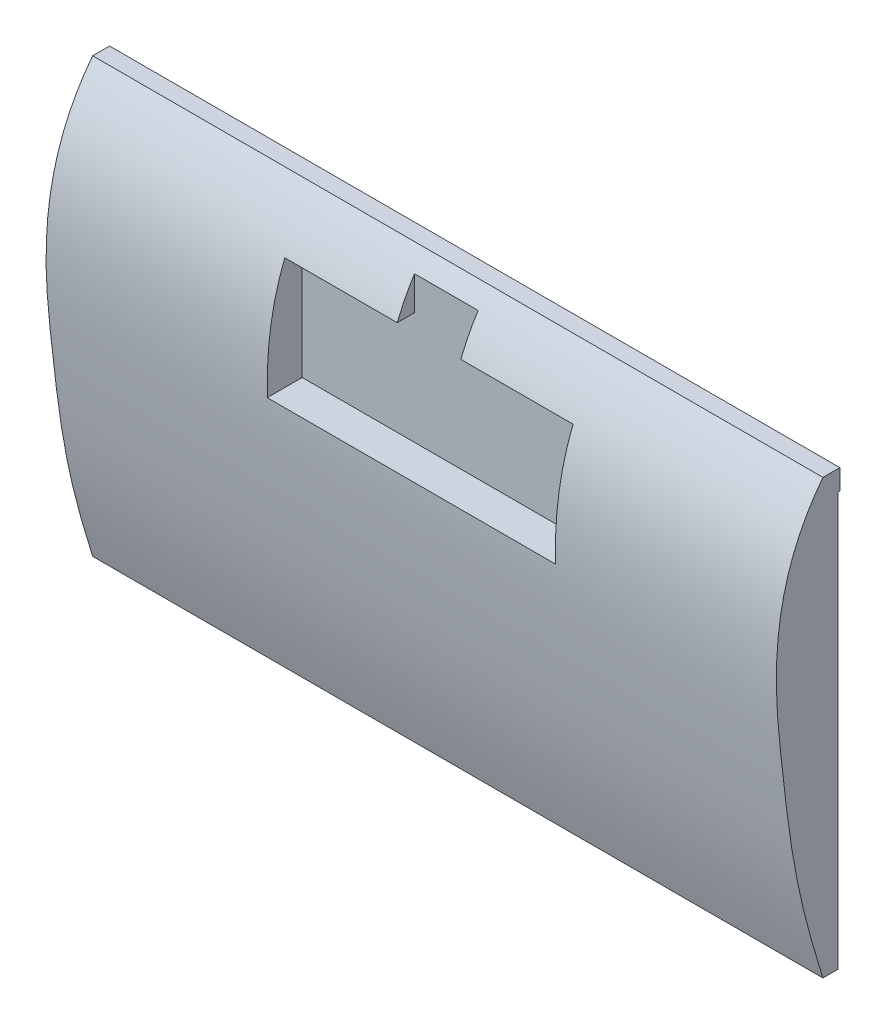
ISO-10303-21;
HEADER;
FILE_DESCRIPTION(('STEP AP214'),'2;1');
FILE_NAME('part.step','',(''),(''),'','','');
FILE_SCHEMA(('AUTOMOTIVE_DESIGN { 1 0 10303 214 1 1 1 1 }'));
ENDSEC;
DATA;
#1=APPLICATION_CONTEXT('core data for automotive mechanical design processes');
#2=APPLICATION_PROTOCOL_DEFINITION('international standard','automotive_design',2000,#1);
#3=PRODUCT_CONTEXT('',#1,'mechanical');
#4=PRODUCT('Part','Part','',(#3));
#5=PRODUCT_RELATED_PRODUCT_CATEGORY('part','',(#4));
#6=PRODUCT_DEFINITION_FORMATION('','',#4);
#7=PRODUCT_DEFINITION_CONTEXT('part definition',#1,'design');
#8=PRODUCT_DEFINITION('design','',#6,#7);
#9=PRODUCT_DEFINITION_SHAPE('','',#8);
#10=(LENGTH_UNIT() NAMED_UNIT(*) SI_UNIT(.MILLI.,.METRE.));
#11=(NAMED_UNIT(*) PLANE_ANGLE_UNIT() SI_UNIT($,.RADIAN.));
#12=(NAMED_UNIT(*) SI_UNIT($,.STERADIAN.) SOLID_ANGLE_UNIT());
#13=UNCERTAINTY_MEASURE_WITH_UNIT(LENGTH_MEASURE(1.E-05),#10,'distance_accuracy_value','');
#14=(GEOMETRIC_REPRESENTATION_CONTEXT(3) GLOBAL_UNCERTAINTY_ASSIGNED_CONTEXT((#13)) GLOBAL_UNIT_ASSIGNED_CONTEXT((#10,
#11,#12)) REPRESENTATION_CONTEXT('',''));
#15=CARTESIAN_POINT('',(0.,0.,0.));
#16=DIRECTION('',(0.,0.,1.));
#17=DIRECTION('',(1.,0.,0.));
#18=AXIS2_PLACEMENT_3D('',#15,#16,#17);
#19=CARTESIAN_POINT('',(0.,0.,0.));
#20=DIRECTION('',(0.,0.,1.));
#21=DIRECTION('',(1.,0.,0.));
#22=AXIS2_PLACEMENT_3D('',#19,#20,#21);
#23=PLANE('',#22);
#24=DIRECTION('',(-1.,0.,0.));
#25=VECTOR('',#24,1.);
#26=CARTESIAN_POINT('',(-269.85,145.2,0.));
#27=LINE('',#26,#25);
#28=CARTESIAN_POINT('',(269.85,145.2,0.));
#29=VERTEX_POINT('',#28);
#30=CARTESIAN_POINT('',(-269.85,145.2,0.));
#31=VERTEX_POINT('',#30);
#32=EDGE_CURVE('E72',#29,#31,#27,.T.);
#33=ORIENTED_EDGE('',*,*,#32,.F.);
#34=DIRECTION('',(0.,1.,0.));
#35=VECTOR('',#34,1.);
#36=CARTESIAN_POINT('',(269.85,160.2,0.));
#37=LINE('',#36,#35);
#38=CARTESIAN_POINT('',(269.85,-160.2,0.));
#39=VERTEX_POINT('',#38);
#40=EDGE_CURVE('E223',#39,#29,#37,.T.);
#41=ORIENTED_EDGE('',*,*,#40,.F.);
#42=DIRECTION('',(1.,0.,0.));
#43=VECTOR('',#42,1.);
#44=CARTESIAN_POINT('',(-269.85,-160.2,0.));
#45=LINE('',#44,#43);
#46=CARTESIAN_POINT('',(-269.85,-160.2,0.));
#47=VERTEX_POINT('',#46);
#48=EDGE_CURVE('E271',#47,#39,#45,.T.);
#49=ORIENTED_EDGE('',*,*,#48,.F.);
#50=DIRECTION('',(0.,-1.,0.));
#51=VECTOR('',#50,1.);
#52=CARTESIAN_POINT('',(-269.85,160.2,0.));
#53=LINE('',#52,#51);
#54=EDGE_CURVE('E265',#31,#47,#53,.T.);
#55=ORIENTED_EDGE('',*,*,#54,.F.);
#56=EDGE_LOOP('',(#33,#41,#49,#55));
#57=FACE_BOUND('',#56,.T.);
#58=ADVANCED_FACE('F57',(#57),#23,.F.);
#59=CARTESIAN_POINT('',(593.045767792688,-160.2,10.9999999999999));
#60=CARTESIAN_POINT('',(593.045767792688,-99.1604529431981,30.1409312448953));
#61=CARTESIAN_POINT('',(593.045767792688,-46.1984389401702,38.0741934930687));
#62=CARTESIAN_POINT('',(593.045767792688,105.581967835009,53.4186788939106));
#63=CARTESIAN_POINT('',(593.045767792688,160.2,11.));
#64=B_SPLINE_CURVE_WITH_KNOTS('',3,(#59,#60,#61,#62,#63),.UNSPECIFIED.,.F.,.F.,(4,1,4),(0.,
0.569165375382371,1.),.UNSPECIFIED.);
#65=DIRECTION('',(-1.,0.,0.));
#66=VECTOR('',#65,1.);
#67=SURFACE_OF_LINEAR_EXTRUSION('',#64,#66);
#68=CARTESIAN_POINT('',(269.85,-160.2,10.9999999999999));
#69=CARTESIAN_POINT('',(269.85,-99.1604529431982,30.1409312448953));
#70=CARTESIAN_POINT('',(269.85,-46.1984389401703,38.0741934930687));
#71=CARTESIAN_POINT('',(269.85,105.581967835009,53.4186788939106));
#72=CARTESIAN_POINT('',(269.85,160.2,11.));
#73=B_SPLINE_CURVE_WITH_KNOTS('',3,(#68,#69,#70,#71,#72),.UNSPECIFIED.,.F.,.F.,(4,1,4),(0.,
0.569165375382371,1.),.UNSPECIFIED.);
#74=CARTESIAN_POINT('',(269.85,160.2,11.));
#75=VERTEX_POINT('',#74);
#76=CARTESIAN_POINT('',(269.85,-160.2,11.));
#77=VERTEX_POINT('',#76);
#78=EDGE_CURVE('E218',#75,#77,#73,.F.);
#79=ORIENTED_EDGE('',*,*,#78,.F.);
#80=DIRECTION('',(-1.,0.,0.));
#81=VECTOR('',#80,1.);
#82=CARTESIAN_POINT('',(-269.85,160.2,11.));
#83=LINE('',#82,#81);
#84=CARTESIAN_POINT('',(-269.85,160.2,11.));
#85=VERTEX_POINT('',#84);
#86=EDGE_CURVE('E276',#75,#85,#83,.T.);
#87=ORIENTED_EDGE('',*,*,#86,.T.);
#88=CARTESIAN_POINT('',(-269.85,-160.2,10.9999999999999));
#89=CARTESIAN_POINT('',(-269.85,-99.1604529431984,30.1409312448953));
#90=CARTESIAN_POINT('',(-269.85,-46.1984389401705,38.0741934930687));
#91=CARTESIAN_POINT('',(-269.85,105.581967835008,53.4186788939106));
#92=CARTESIAN_POINT('',(-269.85,160.2,11.));
#93=B_SPLINE_CURVE_WITH_KNOTS('',3,(#88,#89,#90,#91,#92),.UNSPECIFIED.,.F.,.F.,(4,1,4),(0.,
0.569165375382371,1.),.UNSPECIFIED.);
#94=CARTESIAN_POINT('',(-269.85,-160.2,11.));
#95=VERTEX_POINT('',#94);
#96=EDGE_CURVE('E160',#95,#85,#93,.T.);
#97=ORIENTED_EDGE('',*,*,#96,.F.);
#98=DIRECTION('',(1.,0.,0.));
#99=VECTOR('',#98,1.);
#100=CARTESIAN_POINT('',(-269.85,-160.2,11.));
#101=LINE('',#100,#99);
#102=EDGE_CURVE('E274',#95,#77,#101,.T.);
#103=ORIENTED_EDGE('',*,*,#102,.T.);
#104=EDGE_LOOP('',(#79,#87,#97,#103));
#105=FACE_BOUND('',#104,.T.);
#106=CARTESIAN_POINT('',(-106.5,-160.2,10.9999999999999));
#107=CARTESIAN_POINT('',(-106.5,-99.1604529431983,30.1409312448953));
#108=CARTESIAN_POINT('',(-106.5,-46.1984389401705,38.0741934930687));
#109=CARTESIAN_POINT('',(-106.5,105.581967835008,53.4186788939106));
#110=CARTESIAN_POINT('',(-106.5,160.2,11.));
#111=B_SPLINE_CURVE_WITH_KNOTS('',3,(#106,#107,#108,#109,#110),.UNSPECIFIED.,.F.,.F.,(4,1,4),
(0.,0.569165375382371,1.),.UNSPECIFIED.);
#112=CARTESIAN_POINT('',(-106.5,123.2,32.2921193803987));
#113=VERTEX_POINT('',#112);
#114=CARTESIAN_POINT('',(-106.5,40.2000000000002,45.3093353813427));
#115=VERTEX_POINT('',#114);
#116=EDGE_CURVE('E299',#113,#115,#111,.F.);
#117=ORIENTED_EDGE('',*,*,#116,.F.);
#118=DIRECTION('',(-1.,0.,0.));
#119=VECTOR('',#118,1.);
#120=CARTESIAN_POINT('',(1.17146576669515E-13,123.2,32.2921193803987));
#121=LINE('',#120,#119);
#122=CARTESIAN_POINT('',(-23.5,123.2,32.2921193803987));
#123=VERTEX_POINT('',#122);
#124=EDGE_CURVE('E12',#113,#123,#121,.F.);
#125=ORIENTED_EDGE('',*,*,#124,.T.);
#126=CARTESIAN_POINT('',(-23.5,-160.2,10.9999999999999));
#127=CARTESIAN_POINT('',(-23.5,-99.1604529431983,30.1409312448953));
#128=CARTESIAN_POINT('',(-23.5,-46.1984389401704,38.0741934930687));
#129=CARTESIAN_POINT('',(-23.5000000000001,105.581967835008,53.4186788939106));
#130=CARTESIAN_POINT('',(-23.5000000000001,160.2,11.));
#131=B_SPLINE_CURVE_WITH_KNOTS('',3,(#126,#127,#128,#129,#130),.UNSPECIFIED.,.F.,.F.,(4,1,4),
(0.,0.569165375382371,1.),.UNSPECIFIED.);
#132=CARTESIAN_POINT('',(-23.5,148.117876211777,19.5));
#133=VERTEX_POINT('',#132);
#134=EDGE_CURVE('E65',#133,#123,#131,.F.);
#135=ORIENTED_EDGE('',*,*,#134,.F.);
#136=DIRECTION('',(-1.,0.,0.));
#137=VECTOR('',#136,1.);
#138=CARTESIAN_POINT('',(1.11755637585344E-13,148.117876211777,19.5));
#139=LINE('',#138,#137);
#140=CARTESIAN_POINT('',(23.5,148.117876211777,19.5));
#141=VERTEX_POINT('',#140);
#142=EDGE_CURVE('E306',#141,#133,#139,.T.);
#143=ORIENTED_EDGE('',*,*,#142,.F.);
#144=CARTESIAN_POINT('',(23.5,-160.2,10.9999999999999));
#145=CARTESIAN_POINT('',(23.5,-99.1604529431983,30.1409312448953));
#146=CARTESIAN_POINT('',(23.5,-46.1984389401704,38.0741934930687));
#147=CARTESIAN_POINT('',(23.4999999999999,105.581967835008,53.4186788939106));
#148=CARTESIAN_POINT('',(23.4999999999999,160.2,11.));
#149=B_SPLINE_CURVE_WITH_KNOTS('',3,(#144,#145,#146,#147,#148),.UNSPECIFIED.,.F.,.F.,(4,1,4),
(0.,0.569165375382371,1.),.UNSPECIFIED.);
#150=CARTESIAN_POINT('',(23.5,123.2,32.2921193803987));
#151=VERTEX_POINT('',#150);
#152=EDGE_CURVE('E294',#141,#151,#149,.F.);
#153=ORIENTED_EDGE('',*,*,#152,.T.);
#154=DIRECTION('',(-1.,0.,0.));
#155=VECTOR('',#154,1.);
#156=CARTESIAN_POINT('',(1.17146576669515E-13,123.2,32.2921193803987));
#157=LINE('',#156,#155);
#158=CARTESIAN_POINT('',(106.5,123.2,32.2921193803987));
#159=VERTEX_POINT('',#158);
#160=EDGE_CURVE('E281',#151,#159,#157,.F.);
#161=ORIENTED_EDGE('',*,*,#160,.T.);
#162=CARTESIAN_POINT('',(106.5,-160.2,10.9999999999999));
#163=CARTESIAN_POINT('',(106.5,-99.1604529431983,30.1409312448953));
#164=CARTESIAN_POINT('',(106.5,-46.1984389401704,38.0741934930687));
#165=CARTESIAN_POINT('',(106.5,105.581967835008,53.4186788939106));
#166=CARTESIAN_POINT('',(106.5,160.2,11.));
#167=B_SPLINE_CURVE_WITH_KNOTS('',3,(#162,#163,#164,#165,#166),.UNSPECIFIED.,.F.,.F.,(4,1,4),
(0.,0.569165375382371,1.),.UNSPECIFIED.);
#168=CARTESIAN_POINT('',(106.5,40.2000000000002,45.3093353813427));
#169=VERTEX_POINT('',#168);
#170=EDGE_CURVE('E284',#159,#169,#167,.F.);
#171=ORIENTED_EDGE('',*,*,#170,.T.);
#172=DIRECTION('',(-1.,0.,0.));
#173=VECTOR('',#172,1.);
#174=CARTESIAN_POINT('',(1.57529937230686E-13,40.2000000000002,45.3093353813427));
#175=LINE('',#174,#173);
#176=EDGE_CURVE('E289',#115,#169,#175,.F.);
#177=ORIENTED_EDGE('',*,*,#176,.F.);
#178=EDGE_LOOP('',(#117,#125,#135,#143,#153,#161,#171,#177));
#179=FACE_BOUND('',#178,.T.);
#180=ADVANCED_FACE('F238',(#105,#179),#67,.T.);
#181=CARTESIAN_POINT('',(269.85,160.2,11.));
#182=DIRECTION('',(-1.,0.,0.));
#183=DIRECTION('',(0.,-1.,0.));
#184=AXIS2_PLACEMENT_3D('',#181,#182,#183);
#185=PLANE('',#184);
#186=ORIENTED_EDGE('',*,*,#40,.T.);
#187=DIRECTION('',(0.,0.,1.));
#188=VECTOR('',#187,1.);
#189=CARTESIAN_POINT('',(269.85,145.2,-1.5));
#190=LINE('',#189,#188);
#191=CARTESIAN_POINT('',(269.85,145.2,-1.5));
#192=VERTEX_POINT('',#191);
#193=EDGE_CURVE('E185',#192,#29,#190,.T.);
#194=ORIENTED_EDGE('',*,*,#193,.F.);
#195=DIRECTION('',(0.,-1.,0.));
#196=VECTOR('',#195,1.);
#197=CARTESIAN_POINT('',(269.85,160.2,-1.5));
#198=LINE('',#197,#196);
#199=CARTESIAN_POINT('',(269.85,160.2,-1.5));
#200=VERTEX_POINT('',#199);
#201=EDGE_CURVE('E172',#200,#192,#198,.T.);
#202=ORIENTED_EDGE('',*,*,#201,.F.);
#203=DIRECTION('',(0.,0.,-1.));
#204=VECTOR('',#203,1.);
#205=CARTESIAN_POINT('',(269.85,160.2,11.));
#206=LINE('',#205,#204);
#207=EDGE_CURVE('E164',#75,#200,#206,.T.);
#208=ORIENTED_EDGE('',*,*,#207,.F.);
#209=ORIENTED_EDGE('',*,*,#78,.T.);
#210=DIRECTION('',(0.,0.,-1.));
#211=VECTOR('',#210,1.);
#212=CARTESIAN_POINT('',(269.85,-160.2,11.));
#213=LINE('',#212,#211);
#214=EDGE_CURVE('E263',#77,#39,#213,.T.);
#215=ORIENTED_EDGE('',*,*,#214,.T.);
#216=EDGE_LOOP('',(#186,#194,#202,#208,#209,#215));
#217=FACE_BOUND('',#216,.T.);
#218=ADVANCED_FACE('F59',(#217),#185,.F.);
#219=CARTESIAN_POINT('',(-269.85,160.2,11.));
#220=DIRECTION('',(0.,-1.,0.));
#221=DIRECTION('',(0.,0.,-1.));
#222=AXIS2_PLACEMENT_3D('',#219,#220,#221);
#223=PLANE('',#222);
#224=ORIENTED_EDGE('',*,*,#207,.T.);
#225=DIRECTION('',(1.,0.,0.));
#226=VECTOR('',#225,1.);
#227=CARTESIAN_POINT('',(-269.85,160.2,-1.5));
#228=LINE('',#227,#226);
#229=CARTESIAN_POINT('',(-269.85,160.2,-1.5));
#230=VERTEX_POINT('',#229);
#231=EDGE_CURVE('E168',#230,#200,#228,.T.);
#232=ORIENTED_EDGE('',*,*,#231,.F.);
#233=DIRECTION('',(0.,0.,-1.));
#234=VECTOR('',#233,1.);
#235=CARTESIAN_POINT('',(-269.85,160.2,11.));
#236=LINE('',#235,#234);
#237=EDGE_CURVE('E153',#85,#230,#236,.T.);
#238=ORIENTED_EDGE('',*,*,#237,.F.);
#239=ORIENTED_EDGE('',*,*,#86,.F.);
#240=EDGE_LOOP('',(#224,#232,#238,#239));
#241=FACE_BOUND('',#240,.T.);
#242=ADVANCED_FACE('F169',(#241),#223,.F.);
#243=CARTESIAN_POINT('',(-269.85,160.2,11.));
#244=DIRECTION('',(1.,0.,0.));
#245=DIRECTION('',(0.,1.,0.));
#246=AXIS2_PLACEMENT_3D('',#243,#244,#245);
#247=PLANE('',#246);
#248=ORIENTED_EDGE('',*,*,#237,.T.);
#249=DIRECTION('',(0.,1.,0.));
#250=VECTOR('',#249,1.);
#251=CARTESIAN_POINT('',(-269.85,160.2,-1.5));
#252=LINE('',#251,#250);
#253=CARTESIAN_POINT('',(-269.85,145.2,-1.5));
#254=VERTEX_POINT('',#253);
#255=EDGE_CURVE('E158',#254,#230,#252,.T.);
#256=ORIENTED_EDGE('',*,*,#255,.F.);
#257=DIRECTION('',(0.,0.,1.));
#258=VECTOR('',#257,1.);
#259=CARTESIAN_POINT('',(-269.85,145.2,-1.5));
#260=LINE('',#259,#258);
#261=EDGE_CURVE('E182',#254,#31,#260,.T.);
#262=ORIENTED_EDGE('',*,*,#261,.T.);
#263=ORIENTED_EDGE('',*,*,#54,.T.);
#264=DIRECTION('',(0.,0.,-1.));
#265=VECTOR('',#264,1.);
#266=CARTESIAN_POINT('',(-269.85,-160.2,11.));
#267=LINE('',#266,#265);
#268=EDGE_CURVE('E165',#95,#47,#267,.T.);
#269=ORIENTED_EDGE('',*,*,#268,.F.);
#270=ORIENTED_EDGE('',*,*,#96,.T.);
#271=EDGE_LOOP('',(#248,#256,#262,#263,#269,#270));
#272=FACE_BOUND('',#271,.T.);
#273=ADVANCED_FACE('F155',(#272),#247,.F.);
#274=CARTESIAN_POINT('',(-269.85,-160.2,11.));
#275=DIRECTION('',(0.,1.,0.));
#276=DIRECTION('',(0.,0.,1.));
#277=AXIS2_PLACEMENT_3D('',#274,#275,#276);
#278=PLANE('',#277);
#279=ORIENTED_EDGE('',*,*,#48,.T.);
#280=ORIENTED_EDGE('',*,*,#214,.F.);
#281=ORIENTED_EDGE('',*,*,#102,.F.);
#282=ORIENTED_EDGE('',*,*,#268,.T.);
#283=EDGE_LOOP('',(#279,#280,#281,#282));
#284=FACE_BOUND('',#283,.T.);
#285=ADVANCED_FACE('F247',(#284),#278,.F.);
#286=CARTESIAN_POINT('',(23.5,0.,69.5));
#287=DIRECTION('',(-1.,0.,0.));
#288=DIRECTION('',(0.,0.,1.));
#289=AXIS2_PLACEMENT_3D('',#286,#287,#288);
#290=PLANE('',#289);
#291=DIRECTION('',(0.,1.,0.));
#292=VECTOR('',#291,1.);
#293=CARTESIAN_POINT('',(23.5,0.,19.5));
#294=LINE('',#293,#292);
#295=CARTESIAN_POINT('',(23.5,123.2,19.5));
#296=VERTEX_POINT('',#295);
#297=EDGE_CURVE('E192',#296,#141,#294,.T.);
#298=ORIENTED_EDGE('',*,*,#297,.F.);
#299=DIRECTION('',(0.,0.,-1.));
#300=VECTOR('',#299,1.);
#301=CARTESIAN_POINT('',(23.5,123.2,69.5));
#302=LINE('',#301,#300);
#303=EDGE_CURVE('E196',#151,#296,#302,.T.);
#304=ORIENTED_EDGE('',*,*,#303,.F.);
#305=ORIENTED_EDGE('',*,*,#152,.F.);
#306=EDGE_LOOP('',(#298,#304,#305));
#307=FACE_BOUND('',#306,.T.);
#308=ADVANCED_FACE('F250',(#307),#290,.T.);
#309=CARTESIAN_POINT('',(-23.5,0.,69.5));
#310=DIRECTION('',(-1.,0.,0.));
#311=DIRECTION('',(0.,0.,1.));
#312=AXIS2_PLACEMENT_3D('',#309,#310,#311);
#313=PLANE('',#312);
#314=ORIENTED_EDGE('',*,*,#134,.T.);
#315=DIRECTION('',(0.,0.,-1.));
#316=VECTOR('',#315,1.);
#317=CARTESIAN_POINT('',(-23.5,123.2,69.5));
#318=LINE('',#317,#316);
#319=CARTESIAN_POINT('',(-23.5,123.2,19.5));
#320=VERTEX_POINT('',#319);
#321=EDGE_CURVE('E195',#123,#320,#318,.T.);
#322=ORIENTED_EDGE('',*,*,#321,.T.);
#323=DIRECTION('',(0.,1.,0.));
#324=VECTOR('',#323,1.);
#325=CARTESIAN_POINT('',(-23.5,0.,19.5));
#326=LINE('',#325,#324);
#327=EDGE_CURVE('E189',#320,#133,#326,.T.);
#328=ORIENTED_EDGE('',*,*,#327,.T.);
#329=EDGE_LOOP('',(#314,#322,#328));
#330=FACE_BOUND('',#329,.T.);
#331=ADVANCED_FACE('F318',(#330),#313,.F.);
#332=CARTESIAN_POINT('',(0.,0.,19.5));
#333=DIRECTION('',(0.,0.,-1.));
#334=DIRECTION('',(-1.,0.,0.));
#335=AXIS2_PLACEMENT_3D('',#332,#333,#334);
#336=PLANE('',#335);
#337=ORIENTED_EDGE('',*,*,#142,.T.);
#338=ORIENTED_EDGE('',*,*,#327,.F.);
#339=DIRECTION('',(-1.,0.,0.));
#340=VECTOR('',#339,1.);
#341=CARTESIAN_POINT('',(106.5,123.2,19.5));
#342=LINE('',#341,#340);
#343=CARTESIAN_POINT('',(-106.5,123.2,19.5));
#344=VERTEX_POINT('',#343);
#345=EDGE_CURVE('E201',#320,#344,#342,.T.);
#346=ORIENTED_EDGE('',*,*,#345,.T.);
#347=DIRECTION('',(0.,1.,0.));
#348=VECTOR('',#347,1.);
#349=CARTESIAN_POINT('',(-106.5,40.2000000000002,19.5));
#350=LINE('',#349,#348);
#351=CARTESIAN_POINT('',(-106.5,40.2000000000002,19.5));
#352=VERTEX_POINT('',#351);
#353=EDGE_CURVE('E205',#352,#344,#350,.T.);
#354=ORIENTED_EDGE('',*,*,#353,.F.);
#355=DIRECTION('',(-1.,0.,0.));
#356=VECTOR('',#355,1.);
#357=CARTESIAN_POINT('',(106.5,40.2000000000002,19.5));
#358=LINE('',#357,#356);
#359=CARTESIAN_POINT('',(106.5,40.2000000000002,19.5));
#360=VERTEX_POINT('',#359);
#361=EDGE_CURVE('E208',#360,#352,#358,.T.);
#362=ORIENTED_EDGE('',*,*,#361,.F.);
#363=DIRECTION('',(0.,1.,0.));
#364=VECTOR('',#363,1.);
#365=CARTESIAN_POINT('',(106.5,40.2000000000002,19.5));
#366=LINE('',#365,#364);
#367=CARTESIAN_POINT('',(106.5,123.2,19.5));
#368=VERTEX_POINT('',#367);
#369=EDGE_CURVE('E188',#360,#368,#366,.T.);
#370=ORIENTED_EDGE('',*,*,#369,.T.);
#371=EDGE_CURVE('E202',#368,#296,#342,.T.);
#372=ORIENTED_EDGE('',*,*,#371,.T.);
#373=ORIENTED_EDGE('',*,*,#297,.T.);
#374=EDGE_LOOP('',(#337,#338,#346,#354,#362,#370,#372,#373));
#375=FACE_BOUND('',#374,.T.);
#376=ADVANCED_FACE('F338',(#375),#336,.F.);
#377=CARTESIAN_POINT('',(106.5,40.2000000000002,69.5));
#378=DIRECTION('',(0.,-1.,0.));
#379=DIRECTION('',(0.,0.,-1.));
#380=AXIS2_PLACEMENT_3D('',#377,#378,#379);
#381=PLANE('',#380);
#382=ORIENTED_EDGE('',*,*,#176,.T.);
#383=DIRECTION('',(0.,0.,-1.));
#384=VECTOR('',#383,1.);
#385=CARTESIAN_POINT('',(106.5,40.2000000000002,69.5));
#386=LINE('',#385,#384);
#387=EDGE_CURVE('E211',#169,#360,#386,.T.);
#388=ORIENTED_EDGE('',*,*,#387,.T.);
#389=ORIENTED_EDGE('',*,*,#361,.T.);
#390=DIRECTION('',(0.,0.,-1.));
#391=VECTOR('',#390,1.);
#392=CARTESIAN_POINT('',(-106.5,40.2000000000002,69.5));
#393=LINE('',#392,#391);
#394=EDGE_CURVE('E213',#115,#352,#393,.T.);
#395=ORIENTED_EDGE('',*,*,#394,.F.);
#396=EDGE_LOOP('',(#382,#388,#389,#395));
#397=FACE_BOUND('',#396,.T.);
#398=ADVANCED_FACE('F333',(#397),#381,.F.);
#399=CARTESIAN_POINT('',(106.5,40.2000000000002,69.5));
#400=DIRECTION('',(-1.,0.,0.));
#401=DIRECTION('',(0.,0.,1.));
#402=AXIS2_PLACEMENT_3D('',#399,#400,#401);
#403=PLANE('',#402);
#404=DIRECTION('',(0.,0.,-1.));
#405=VECTOR('',#404,1.);
#406=CARTESIAN_POINT('',(106.5,123.2,69.5));
#407=LINE('',#406,#405);
#408=EDGE_CURVE('E80',#159,#368,#407,.T.);
#409=ORIENTED_EDGE('',*,*,#408,.T.);
#410=ORIENTED_EDGE('',*,*,#369,.F.);
#411=ORIENTED_EDGE('',*,*,#387,.F.);
#412=ORIENTED_EDGE('',*,*,#170,.F.);
#413=EDGE_LOOP('',(#409,#410,#411,#412));
#414=FACE_BOUND('',#413,.T.);
#415=ADVANCED_FACE('F243',(#414),#403,.T.);
#416=CARTESIAN_POINT('',(-106.5,40.2000000000002,69.5));
#417=DIRECTION('',(-1.,0.,0.));
#418=DIRECTION('',(0.,0.,1.));
#419=AXIS2_PLACEMENT_3D('',#416,#417,#418);
#420=PLANE('',#419);
#421=ORIENTED_EDGE('',*,*,#116,.T.);
#422=ORIENTED_EDGE('',*,*,#394,.T.);
#423=ORIENTED_EDGE('',*,*,#353,.T.);
#424=DIRECTION('',(0.,0.,-1.));
#425=VECTOR('',#424,1.);
#426=CARTESIAN_POINT('',(-106.5,123.2,69.5));
#427=LINE('',#426,#425);
#428=EDGE_CURVE('E215',#113,#344,#427,.T.);
#429=ORIENTED_EDGE('',*,*,#428,.F.);
#430=EDGE_LOOP('',(#421,#422,#423,#429));
#431=FACE_BOUND('',#430,.T.);
#432=ADVANCED_FACE('F330',(#431),#420,.F.);
#433=CARTESIAN_POINT('',(106.5,123.2,69.5));
#434=DIRECTION('',(0.,-1.,0.));
#435=DIRECTION('',(0.,0.,-1.));
#436=AXIS2_PLACEMENT_3D('',#433,#434,#435);
#437=PLANE('',#436);
#438=ORIENTED_EDGE('',*,*,#428,.T.);
#439=ORIENTED_EDGE('',*,*,#345,.F.);
#440=ORIENTED_EDGE('',*,*,#321,.F.);
#441=ORIENTED_EDGE('',*,*,#124,.F.);
#442=EDGE_LOOP('',(#438,#439,#440,#441));
#443=FACE_BOUND('',#442,.T.);
#444=ADVANCED_FACE('F252',(#443),#437,.T.);
#445=ORIENTED_EDGE('',*,*,#303,.T.);
#446=ORIENTED_EDGE('',*,*,#371,.F.);
#447=ORIENTED_EDGE('',*,*,#408,.F.);
#448=ORIENTED_EDGE('',*,*,#160,.F.);
#449=EDGE_LOOP('',(#445,#446,#447,#448));
#450=FACE_BOUND('',#449,.T.);
#451=ADVANCED_FACE('F342',(#450),#437,.T.);
#452=CARTESIAN_POINT('',(-269.85,145.2,-1.5));
#453=DIRECTION('',(0.,1.,0.));
#454=DIRECTION('',(-1.,0.,0.));
#455=AXIS2_PLACEMENT_3D('',#452,#453,#454);
#456=PLANE('',#455);
#457=ORIENTED_EDGE('',*,*,#32,.T.);
#458=ORIENTED_EDGE('',*,*,#261,.F.);
#459=DIRECTION('',(-1.,0.,0.));
#460=VECTOR('',#459,1.);
#461=CARTESIAN_POINT('',(-269.85,145.2,-1.5));
#462=LINE('',#461,#460);
#463=EDGE_CURVE('E176',#192,#254,#462,.T.);
#464=ORIENTED_EDGE('',*,*,#463,.F.);
#465=ORIENTED_EDGE('',*,*,#193,.T.);
#466=EDGE_LOOP('',(#457,#458,#464,#465));
#467=FACE_BOUND('',#466,.T.);
#468=ADVANCED_FACE('F268',(#467),#456,.F.);
#469=CARTESIAN_POINT('',(0.,0.,-1.5));
#470=DIRECTION('',(0.,0.,1.));
#471=DIRECTION('',(1.,0.,0.));
#472=AXIS2_PLACEMENT_3D('',#469,#470,#471);
#473=PLANE('',#472);
#474=ORIENTED_EDGE('',*,*,#255,.T.);
#475=ORIENTED_EDGE('',*,*,#231,.T.);
#476=ORIENTED_EDGE('',*,*,#201,.T.);
#477=ORIENTED_EDGE('',*,*,#463,.T.);
#478=EDGE_LOOP('',(#474,#475,#476,#477));
#479=FACE_BOUND('',#478,.T.);
#480=ADVANCED_FACE('F174',(#479),#473,.F.);
#481=CLOSED_SHELL('',(#58,#180,#218,#242,#273,#285,#308,#331,#376,#398,#415,#432,#444,#451,#468,#480));
#482=MANIFOLD_SOLID_BREP('B2',#481);
#483=ADVANCED_BREP_SHAPE_REPRESENTATION('',(#18,#482),#14);
#484=SHAPE_DEFINITION_REPRESENTATION(#9,#483);
ENDSEC;
END-ISO-10303-21;
